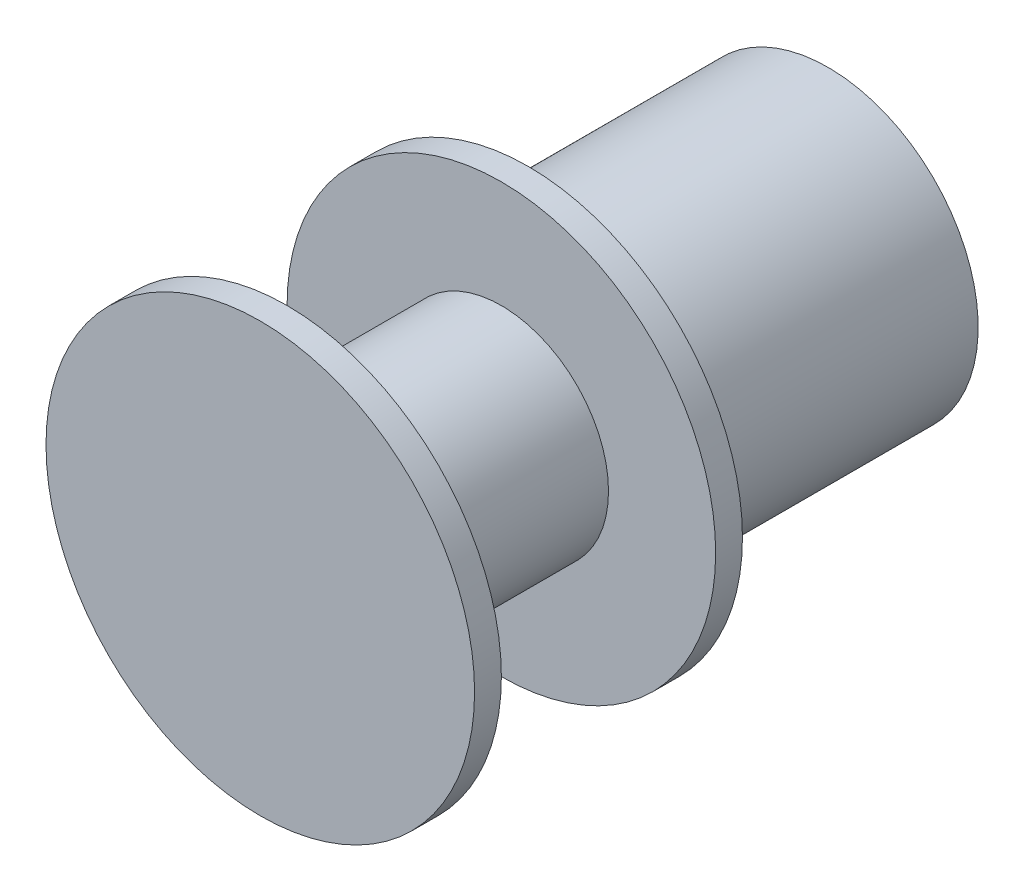
ISO-10303-21;
HEADER;
FILE_DESCRIPTION(('STEP AP214'),'2;1');
FILE_NAME('part.step','',(''),(''),'','','');
FILE_SCHEMA(('AUTOMOTIVE_DESIGN { 1 0 10303 214 1 1 1 1 }'));
ENDSEC;
DATA;
#1=APPLICATION_CONTEXT('core data for automotive mechanical design processes');
#2=APPLICATION_PROTOCOL_DEFINITION('international standard','automotive_design',2000,#1);
#3=PRODUCT_CONTEXT('',#1,'mechanical');
#4=PRODUCT('Part','Part','',(#3));
#5=PRODUCT_RELATED_PRODUCT_CATEGORY('part','',(#4));
#6=PRODUCT_DEFINITION_FORMATION('','',#4);
#7=PRODUCT_DEFINITION_CONTEXT('part definition',#1,'design');
#8=PRODUCT_DEFINITION('design','',#6,#7);
#9=PRODUCT_DEFINITION_SHAPE('','',#8);
#10=(LENGTH_UNIT() NAMED_UNIT(*) SI_UNIT(.MILLI.,.METRE.));
#11=(NAMED_UNIT(*) PLANE_ANGLE_UNIT() SI_UNIT($,.RADIAN.));
#12=(NAMED_UNIT(*) SI_UNIT($,.STERADIAN.) SOLID_ANGLE_UNIT());
#13=UNCERTAINTY_MEASURE_WITH_UNIT(LENGTH_MEASURE(1.E-05),#10,'distance_accuracy_value','');
#14=(GEOMETRIC_REPRESENTATION_CONTEXT(3) GLOBAL_UNCERTAINTY_ASSIGNED_CONTEXT((#13)) GLOBAL_UNIT_ASSIGNED_CONTEXT((#10,
#11,#12)) REPRESENTATION_CONTEXT('',''));
#15=CARTESIAN_POINT('',(0.,0.,0.));
#16=DIRECTION('',(0.,0.,1.));
#17=DIRECTION('',(1.,0.,0.));
#18=AXIS2_PLACEMENT_3D('',#15,#16,#17);
#19=CARTESIAN_POINT('',(0.,0.,0.79375));
#20=DIRECTION('',(0.,0.,-1.));
#21=DIRECTION('',(-1.,0.,0.));
#22=AXIS2_PLACEMENT_3D('',#19,#20,#21);
#23=CYLINDRICAL_SURFACE('',#22,6.35);
#24=CARTESIAN_POINT('',(0.,0.,0.79375));
#25=DIRECTION('',(0.,0.,1.));
#26=DIRECTION('',(1.,0.,0.));
#27=AXIS2_PLACEMENT_3D('',#24,#25,#26);
#28=CIRCLE('',#27,6.35);
#29=CARTESIAN_POINT('',(6.35,0.,0.79375));
#30=VERTEX_POINT('',#29);
#31=EDGE_CURVE('E51',#30,#30,#28,.T.);
#32=ORIENTED_EDGE('',*,*,#31,.F.);
#33=EDGE_LOOP('',(#32));
#34=FACE_BOUND('',#33,.T.);
#35=CARTESIAN_POINT('',(0.,0.,0.));
#36=DIRECTION('',(0.,0.,1.));
#37=DIRECTION('',(1.,0.,0.));
#38=AXIS2_PLACEMENT_3D('',#35,#36,#37);
#39=CIRCLE('',#38,6.35);
#40=CARTESIAN_POINT('',(6.35,0.,0.));
#41=VERTEX_POINT('',#40);
#42=EDGE_CURVE('E40',#41,#41,#39,.T.);
#43=ORIENTED_EDGE('',*,*,#42,.T.);
#44=EDGE_LOOP('',(#43));
#45=FACE_BOUND('',#44,.T.);
#46=ADVANCED_FACE('F37',(#34,#45),#23,.T.);
#47=CARTESIAN_POINT('',(0.,0.,0.79375));
#48=DIRECTION('',(0.,0.,1.));
#49=DIRECTION('',(1.,0.,0.));
#50=AXIS2_PLACEMENT_3D('',#47,#48,#49);
#51=PLANE('',#50);
#52=CARTESIAN_POINT('',(0.,0.,0.79375));
#53=DIRECTION('',(0.,0.,1.));
#54=DIRECTION('',(1.,0.,0.));
#55=AXIS2_PLACEMENT_3D('',#52,#53,#54);
#56=CIRCLE('',#55,3.175);
#57=CARTESIAN_POINT('',(3.175,0.,0.79375));
#58=VERTEX_POINT('',#57);
#59=EDGE_CURVE('E45',#58,#58,#56,.T.);
#60=ORIENTED_EDGE('',*,*,#59,.F.);
#61=EDGE_LOOP('',(#60));
#62=FACE_BOUND('',#61,.T.);
#63=ORIENTED_EDGE('',*,*,#31,.T.);
#64=EDGE_LOOP('',(#63));
#65=FACE_BOUND('',#64,.T.);
#66=ADVANCED_FACE('F80',(#62,#65),#51,.T.);
#67=CARTESIAN_POINT('',(0.,0.,0.));
#68=DIRECTION('',(0.,0.,1.));
#69=DIRECTION('',(1.,0.,0.));
#70=AXIS2_PLACEMENT_3D('',#67,#68,#69);
#71=PLANE('',#70);
#72=CARTESIAN_POINT('',(0.,0.,0.));
#73=DIRECTION('',(0.,0.,-1.));
#74=DIRECTION('',(-1.,0.,0.));
#75=AXIS2_PLACEMENT_3D('',#72,#73,#74);
#76=CIRCLE('',#75,4.445);
#77=CARTESIAN_POINT('',(-4.445,0.,0.));
#78=VERTEX_POINT('',#77);
#79=EDGE_CURVE('E10',#78,#78,#76,.T.);
#80=ORIENTED_EDGE('',*,*,#79,.F.);
#81=EDGE_LOOP('',(#80));
#82=FACE_BOUND('',#81,.T.);
#83=ORIENTED_EDGE('',*,*,#42,.F.);
#84=EDGE_LOOP('',(#83));
#85=FACE_BOUND('',#84,.T.);
#86=ADVANCED_FACE('F77',(#82,#85),#71,.F.);
#87=CARTESIAN_POINT('',(0.,0.,7.14375));
#88=DIRECTION('',(0.,0.,-1.));
#89=DIRECTION('',(-1.,0.,0.));
#90=AXIS2_PLACEMENT_3D('',#87,#88,#89);
#91=CYLINDRICAL_SURFACE('',#90,3.175);
#92=CARTESIAN_POINT('',(0.,0.,7.14375));
#93=DIRECTION('',(0.,0.,1.));
#94=DIRECTION('',(1.,0.,0.));
#95=AXIS2_PLACEMENT_3D('',#92,#93,#94);
#96=CIRCLE('',#95,3.175);
#97=CARTESIAN_POINT('',(3.175,0.,7.14375));
#98=VERTEX_POINT('',#97);
#99=EDGE_CURVE('E61',#98,#98,#96,.T.);
#100=ORIENTED_EDGE('',*,*,#99,.F.);
#101=EDGE_LOOP('',(#100));
#102=FACE_BOUND('',#101,.T.);
#103=ORIENTED_EDGE('',*,*,#59,.T.);
#104=EDGE_LOOP('',(#103));
#105=FACE_BOUND('',#104,.T.);
#106=ADVANCED_FACE('F79',(#102,#105),#91,.T.);
#107=CARTESIAN_POINT('',(0.,0.,7.9375));
#108=DIRECTION('',(0.,0.,-1.));
#109=DIRECTION('',(-1.,0.,0.));
#110=AXIS2_PLACEMENT_3D('',#107,#108,#109);
#111=CYLINDRICAL_SURFACE('',#110,6.35);
#112=CARTESIAN_POINT('',(0.,0.,7.9375));
#113=DIRECTION('',(0.,0.,1.));
#114=DIRECTION('',(1.,0.,0.));
#115=AXIS2_PLACEMENT_3D('',#112,#113,#114);
#116=CIRCLE('',#115,6.35);
#117=CARTESIAN_POINT('',(6.35,0.,7.9375));
#118=VERTEX_POINT('',#117);
#119=EDGE_CURVE('E57',#118,#118,#116,.T.);
#120=ORIENTED_EDGE('',*,*,#119,.F.);
#121=EDGE_LOOP('',(#120));
#122=FACE_BOUND('',#121,.T.);
#123=CARTESIAN_POINT('',(0.,0.,7.14375));
#124=DIRECTION('',(0.,0.,1.));
#125=DIRECTION('',(1.,0.,0.));
#126=AXIS2_PLACEMENT_3D('',#123,#124,#125);
#127=CIRCLE('',#126,6.35);
#128=CARTESIAN_POINT('',(6.35,0.,7.14375));
#129=VERTEX_POINT('',#128);
#130=EDGE_CURVE('E62',#129,#129,#127,.T.);
#131=ORIENTED_EDGE('',*,*,#130,.T.);
#132=EDGE_LOOP('',(#131));
#133=FACE_BOUND('',#132,.T.);
#134=ADVANCED_FACE('F86',(#122,#133),#111,.T.);
#135=CARTESIAN_POINT('',(0.,0.,7.9375));
#136=DIRECTION('',(0.,0.,1.));
#137=DIRECTION('',(1.,0.,0.));
#138=AXIS2_PLACEMENT_3D('',#135,#136,#137);
#139=PLANE('',#138);
#140=ORIENTED_EDGE('',*,*,#119,.T.);
#141=EDGE_LOOP('',(#140));
#142=FACE_BOUND('',#141,.T.);
#143=ADVANCED_FACE('F115',(#142),#139,.T.);
#144=CARTESIAN_POINT('',(0.,0.,7.14375));
#145=DIRECTION('',(0.,0.,1.));
#146=DIRECTION('',(1.,0.,0.));
#147=AXIS2_PLACEMENT_3D('',#144,#145,#146);
#148=PLANE('',#147);
#149=ORIENTED_EDGE('',*,*,#99,.T.);
#150=EDGE_LOOP('',(#149));
#151=FACE_BOUND('',#150,.T.);
#152=ORIENTED_EDGE('',*,*,#130,.F.);
#153=EDGE_LOOP('',(#152));
#154=FACE_BOUND('',#153,.T.);
#155=ADVANCED_FACE('F125',(#151,#154),#148,.F.);
#156=CARTESIAN_POINT('',(0.,0.,-8.89));
#157=DIRECTION('',(0.,0.,1.));
#158=DIRECTION('',(1.,0.,0.));
#159=AXIS2_PLACEMENT_3D('',#156,#157,#158);
#160=CYLINDRICAL_SURFACE('',#159,4.445);
#161=CARTESIAN_POINT('',(0.,0.,-8.89));
#162=DIRECTION('',(0.,0.,-1.));
#163=DIRECTION('',(-1.,0.,0.));
#164=AXIS2_PLACEMENT_3D('',#161,#162,#163);
#165=CIRCLE('',#164,4.445);
#166=CARTESIAN_POINT('',(-4.445,0.,-8.89));
#167=VERTEX_POINT('',#166);
#168=EDGE_CURVE('E55',#167,#167,#165,.T.);
#169=ORIENTED_EDGE('',*,*,#168,.F.);
#170=EDGE_LOOP('',(#169));
#171=FACE_BOUND('',#170,.T.);
#172=ORIENTED_EDGE('',*,*,#79,.T.);
#173=EDGE_LOOP('',(#172));
#174=FACE_BOUND('',#173,.T.);
#175=ADVANCED_FACE('F134',(#171,#174),#160,.T.);
#176=CARTESIAN_POINT('',(0.,0.,-8.89));
#177=DIRECTION('',(0.,0.,-1.));
#178=DIRECTION('',(-1.,0.,0.));
#179=AXIS2_PLACEMENT_3D('',#176,#177,#178);
#180=PLANE('',#179);
#181=CARTESIAN_POINT('',(0.,0.,-8.89));
#182=DIRECTION('',(0.,0.,-1.));
#183=DIRECTION('',(-1.,0.,0.));
#184=AXIS2_PLACEMENT_3D('',#181,#182,#183);
#185=CIRCLE('',#184,3.175);
#186=CARTESIAN_POINT('',(-3.175,0.,-8.89));
#187=VERTEX_POINT('',#186);
#188=EDGE_CURVE('E186',#187,#187,#185,.T.);
#189=ORIENTED_EDGE('',*,*,#188,.F.);
#190=EDGE_LOOP('',(#189));
#191=FACE_BOUND('',#190,.T.);
#192=ORIENTED_EDGE('',*,*,#168,.T.);
#193=EDGE_LOOP('',(#192));
#194=FACE_BOUND('',#193,.T.);
#195=ADVANCED_FACE('F148',(#191,#194),#180,.T.);
#196=CARTESIAN_POINT('',(0.,0.,-5.715));
#197=DIRECTION('',(0.,0.,-1.));
#198=DIRECTION('',(-1.,0.,0.));
#199=AXIS2_PLACEMENT_3D('',#196,#197,#198);
#200=CYLINDRICAL_SURFACE('',#199,3.175);
#201=CARTESIAN_POINT('',(0.,0.,-5.715));
#202=DIRECTION('',(0.,0.,-1.));
#203=DIRECTION('',(-1.,0.,0.));
#204=AXIS2_PLACEMENT_3D('',#201,#202,#203);
#205=CIRCLE('',#204,3.175);
#206=CARTESIAN_POINT('',(-3.175,0.,-5.715));
#207=VERTEX_POINT('',#206);
#208=EDGE_CURVE('E184',#207,#207,#205,.T.);
#209=ORIENTED_EDGE('',*,*,#208,.F.);
#210=EDGE_LOOP('',(#209));
#211=FACE_BOUND('',#210,.T.);
#212=ORIENTED_EDGE('',*,*,#188,.T.);
#213=EDGE_LOOP('',(#212));
#214=FACE_BOUND('',#213,.T.);
#215=ADVANCED_FACE('F158',(#211,#214),#200,.F.);
#216=CARTESIAN_POINT('',(0.,0.,-5.715));
#217=DIRECTION('',(0.,0.,-1.));
#218=DIRECTION('',(-1.,0.,0.));
#219=AXIS2_PLACEMENT_3D('',#216,#217,#218);
#220=PLANE('',#219);
#221=ORIENTED_EDGE('',*,*,#208,.T.);
#222=EDGE_LOOP('',(#221));
#223=FACE_BOUND('',#222,.T.);
#224=ADVANCED_FACE('F168',(#223),#220,.T.);
#225=CLOSED_SHELL('',(#46,#66,#86,#106,#134,#143,#155,#175,#195,#215,#224));
#226=MANIFOLD_SOLID_BREP('B2',#225);
#227=ADVANCED_BREP_SHAPE_REPRESENTATION('',(#18,#226),#14);
#228=SHAPE_DEFINITION_REPRESENTATION(#9,#227);
ENDSEC;
END-ISO-10303-21;
